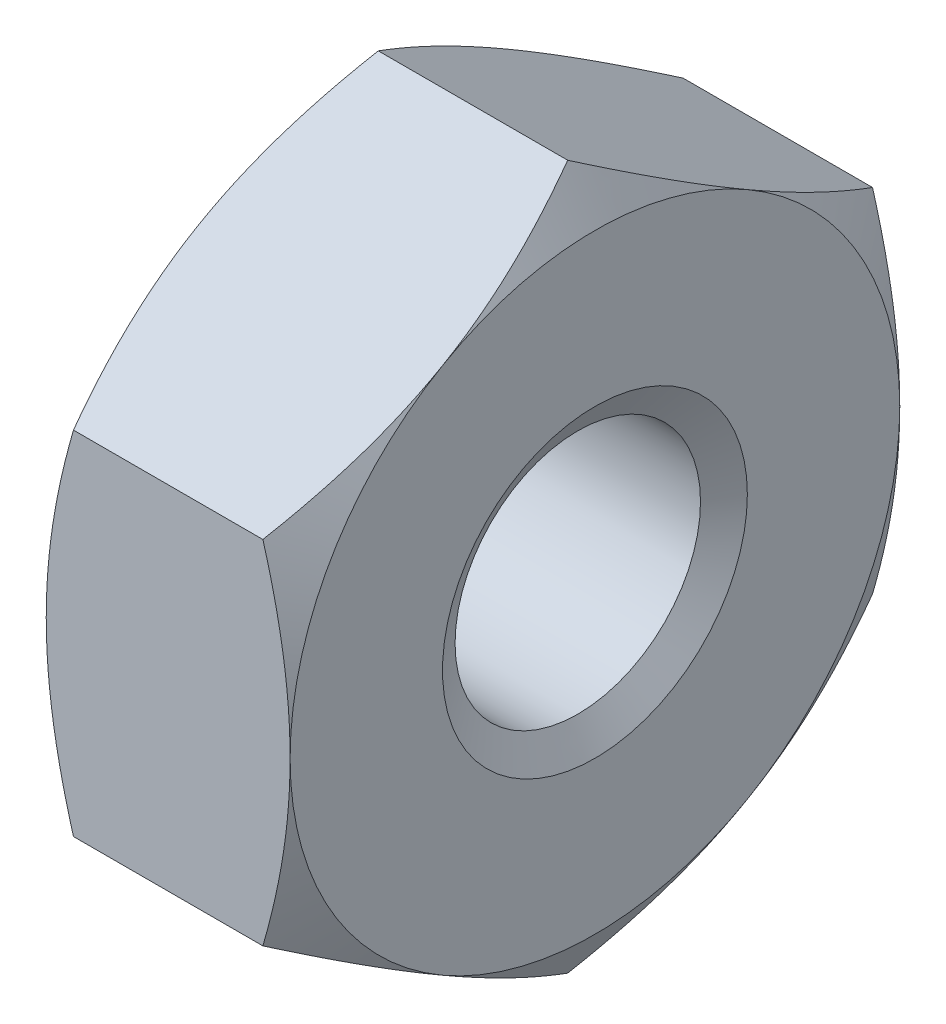
ISO-10303-21;
HEADER;
FILE_DESCRIPTION(('STEP AP214'),'2;1');
FILE_NAME('part.step','',(''),(''),'','','');
FILE_SCHEMA(('AUTOMOTIVE_DESIGN { 1 0 10303 214 1 1 1 1 }'));
ENDSEC;
DATA;
#1=APPLICATION_CONTEXT('core data for automotive mechanical design processes');
#2=APPLICATION_PROTOCOL_DEFINITION('international standard','automotive_design',2000,#1);
#3=PRODUCT_CONTEXT('',#1,'mechanical');
#4=PRODUCT('Part','Part','',(#3));
#5=PRODUCT_RELATED_PRODUCT_CATEGORY('part','',(#4));
#6=PRODUCT_DEFINITION_FORMATION('','',#4);
#7=PRODUCT_DEFINITION_CONTEXT('part definition',#1,'design');
#8=PRODUCT_DEFINITION('design','',#6,#7);
#9=PRODUCT_DEFINITION_SHAPE('','',#8);
#10=(LENGTH_UNIT() NAMED_UNIT(*) SI_UNIT(.MILLI.,.METRE.));
#11=(NAMED_UNIT(*) PLANE_ANGLE_UNIT() SI_UNIT($,.RADIAN.));
#12=(NAMED_UNIT(*) SI_UNIT($,.STERADIAN.) SOLID_ANGLE_UNIT());
#13=UNCERTAINTY_MEASURE_WITH_UNIT(LENGTH_MEASURE(1.E-05),#10,'distance_accuracy_value','');
#14=(GEOMETRIC_REPRESENTATION_CONTEXT(3) GLOBAL_UNCERTAINTY_ASSIGNED_CONTEXT((#13)) GLOBAL_UNIT_ASSIGNED_CONTEXT((#10,
#11,#12)) REPRESENTATION_CONTEXT('',''));
#15=CARTESIAN_POINT('',(0.,0.,0.));
#16=DIRECTION('',(0.,0.,1.));
#17=DIRECTION('',(1.,0.,0.));
#18=AXIS2_PLACEMENT_3D('',#15,#16,#17);
#19=CARTESIAN_POINT('',(0.,-1.44337567297406,-2.5));
#20=DIRECTION('',(0.,-0.866025403784438,-0.5));
#21=DIRECTION('',(0.,0.5,-0.866025403784438));
#22=AXIS2_PLACEMENT_3D('',#19,#20,#21);
#23=PLANE('',#22);
#24=CARTESIAN_POINT('',(0.,-2.16506350946109,-1.25));
#25=CARTESIAN_POINT('',(0.,-1.83012701892219,-1.83012701892219));
#26=CARTESIAN_POINT('',(0.223290993692602,-1.44337567297406,-2.5));
#27=(BOUNDED_CURVE() B_SPLINE_CURVE(2,(#24,#25,#26),.UNSPECIFIED.,.F.,
.F.) B_SPLINE_CURVE_WITH_KNOTS((3,3),(0.146427429693811,0.292854859387622),
.UNSPECIFIED.) CURVE() GEOMETRIC_REPRESENTATION_ITEM() RATIONAL_B_SPLINE_CURVE((1.,
1.03795484930203,1.)) REPRESENTATION_ITEM(''));
#28=CARTESIAN_POINT('',(0.,-2.16506350946109,-1.25));
#29=VERTEX_POINT('',#28);
#30=CARTESIAN_POINT('',(0.223290993692602,-1.44337567297406,-2.5));
#31=VERTEX_POINT('',#30);
#32=EDGE_CURVE('E382',#29,#31,#27,.T.);
#33=ORIENTED_EDGE('',*,*,#32,.T.);
#34=DIRECTION('',(1.,0.,0.));
#35=VECTOR('',#34,1.);
#36=CARTESIAN_POINT('',(0.,-1.44337567297406,-2.5));
#37=LINE('',#36,#35);
#38=CARTESIAN_POINT('',(1.7767090063074,-1.44337567297406,-2.5));
#39=VERTEX_POINT('',#38);
#40=EDGE_CURVE('E11',#31,#39,#37,.T.);
#41=ORIENTED_EDGE('',*,*,#40,.T.);
#42=CARTESIAN_POINT('',(1.7767090063074,-1.44337567297406,-2.5));
#43=CARTESIAN_POINT('',(2.,-1.83012701892219,-1.8301270189222));
#44=CARTESIAN_POINT('',(2.,-2.16506350946109,-1.25));
#45=(BOUNDED_CURVE() B_SPLINE_CURVE(2,(#42,#43,#44),.UNSPECIFIED.,.F.,
.F.) B_SPLINE_CURVE_WITH_KNOTS((3,3),(0.,0.146427429693811),
.UNSPECIFIED.) CURVE() GEOMETRIC_REPRESENTATION_ITEM() RATIONAL_B_SPLINE_CURVE((1.,
1.03795484930204,1.)) REPRESENTATION_ITEM(''));
#46=CARTESIAN_POINT('',(2.,-2.16506350946109,-1.25));
#47=VERTEX_POINT('',#46);
#48=EDGE_CURVE('E244',#39,#47,#45,.T.);
#49=ORIENTED_EDGE('',*,*,#48,.T.);
#50=CARTESIAN_POINT('',(2.,-2.16506350946109,-1.25));
#51=CARTESIAN_POINT('',(2.,-2.5,-0.669872981077806));
#52=CARTESIAN_POINT('',(1.7767090063074,-2.88675134594813,0.));
#53=(BOUNDED_CURVE() B_SPLINE_CURVE(2,(#50,#51,#52),.UNSPECIFIED.,.F.,
.F.) B_SPLINE_CURVE_WITH_KNOTS((3,3),(0.146427429693811,0.292854859387622),
.UNSPECIFIED.) CURVE() GEOMETRIC_REPRESENTATION_ITEM() RATIONAL_B_SPLINE_CURVE((1.,
1.03795484930203,1.)) REPRESENTATION_ITEM(''));
#54=CARTESIAN_POINT('',(1.7767090063074,-2.88675134594813,0.));
#55=VERTEX_POINT('',#54);
#56=EDGE_CURVE('E336',#47,#55,#53,.T.);
#57=ORIENTED_EDGE('',*,*,#56,.T.);
#58=DIRECTION('',(1.,0.,0.));
#59=VECTOR('',#58,1.);
#60=CARTESIAN_POINT('',(0.,-2.88675134594813,0.));
#61=LINE('',#60,#59);
#62=CARTESIAN_POINT('',(0.223290993692602,-2.88675134594813,0.));
#63=VERTEX_POINT('',#62);
#64=EDGE_CURVE('E159',#63,#55,#61,.T.);
#65=ORIENTED_EDGE('',*,*,#64,.F.);
#66=CARTESIAN_POINT('',(0.223290993692602,-2.88675134594813,0.));
#67=CARTESIAN_POINT('',(0.,-2.5,-0.669872981077807));
#68=CARTESIAN_POINT('',(0.,-2.16506350946109,-1.25));
#69=(BOUNDED_CURVE() B_SPLINE_CURVE(2,(#66,#67,#68),.UNSPECIFIED.,.F.,
.F.) B_SPLINE_CURVE_WITH_KNOTS((3,3),(0.,0.146427429693811),
.UNSPECIFIED.) CURVE() GEOMETRIC_REPRESENTATION_ITEM() RATIONAL_B_SPLINE_CURVE((1.,
1.03795484930203,1.)) REPRESENTATION_ITEM(''));
#70=EDGE_CURVE('E256',#63,#29,#69,.T.);
#71=ORIENTED_EDGE('',*,*,#70,.T.);
#72=EDGE_LOOP('',(#33,#41,#49,#57,#65,#71));
#73=FACE_BOUND('',#72,.T.);
#74=ADVANCED_FACE('F17',(#73),#23,.T.);
#75=CARTESIAN_POINT('',(0.,1.44337567297407,-2.5));
#76=DIRECTION('',(0.,0.,-1.));
#77=DIRECTION('',(-1.,0.,0.));
#78=AXIS2_PLACEMENT_3D('',#75,#76,#77);
#79=PLANE('',#78);
#80=CARTESIAN_POINT('',(0.,0.,-2.5));
#81=CARTESIAN_POINT('',(0.,0.669872981077811,-2.5));
#82=CARTESIAN_POINT('',(0.223290993692602,1.44337567297407,-2.5));
#83=(BOUNDED_CURVE() B_SPLINE_CURVE(2,(#80,#81,#82),.UNSPECIFIED.,.F.,
.F.) B_SPLINE_CURVE_WITH_KNOTS((3,3),(0.146427429693811,0.292854859387621),
.UNSPECIFIED.) CURVE() GEOMETRIC_REPRESENTATION_ITEM() RATIONAL_B_SPLINE_CURVE((1.,
1.03795484930204,1.)) REPRESENTATION_ITEM(''));
#84=CARTESIAN_POINT('',(0.,0.,-2.5));
#85=VERTEX_POINT('',#84);
#86=CARTESIAN_POINT('',(0.223290993692602,1.44337567297407,-2.5));
#87=VERTEX_POINT('',#86);
#88=EDGE_CURVE('E163',#85,#87,#83,.T.);
#89=ORIENTED_EDGE('',*,*,#88,.T.);
#90=DIRECTION('',(1.,0.,0.));
#91=VECTOR('',#90,1.);
#92=CARTESIAN_POINT('',(0.,1.44337567297407,-2.5));
#93=LINE('',#92,#91);
#94=CARTESIAN_POINT('',(1.7767090063074,1.44337567297407,-2.5));
#95=VERTEX_POINT('',#94);
#96=EDGE_CURVE('E28',#87,#95,#93,.T.);
#97=ORIENTED_EDGE('',*,*,#96,.T.);
#98=CARTESIAN_POINT('',(1.7767090063074,1.44337567297407,-2.5));
#99=CARTESIAN_POINT('',(2.,0.66987298107781,-2.5));
#100=CARTESIAN_POINT('',(2.,0.,-2.5));
#101=(BOUNDED_CURVE() B_SPLINE_CURVE(2,(#98,#99,#100),.UNSPECIFIED.,.F.,
.F.) B_SPLINE_CURVE_WITH_KNOTS((3,3),(0.,0.146427429693811),
.UNSPECIFIED.) CURVE() GEOMETRIC_REPRESENTATION_ITEM() RATIONAL_B_SPLINE_CURVE((1.,
1.03795484930205,1.)) REPRESENTATION_ITEM(''));
#102=CARTESIAN_POINT('',(2.,0.,-2.5));
#103=VERTEX_POINT('',#102);
#104=EDGE_CURVE('E312',#95,#103,#101,.T.);
#105=ORIENTED_EDGE('',*,*,#104,.T.);
#106=CARTESIAN_POINT('',(2.,0.,-2.5));
#107=CARTESIAN_POINT('',(2.,-0.669872981077801,-2.5));
#108=CARTESIAN_POINT('',(1.7767090063074,-1.44337567297406,-2.5));
#109=(BOUNDED_CURVE() B_SPLINE_CURVE(2,(#106,#107,#108),.UNSPECIFIED.,.F.,
.F.) B_SPLINE_CURVE_WITH_KNOTS((3,3),(0.146427429693811,0.292854859387622),
.UNSPECIFIED.) CURVE() GEOMETRIC_REPRESENTATION_ITEM() RATIONAL_B_SPLINE_CURVE((1.,
1.03795484930206,1.)) REPRESENTATION_ITEM(''));
#110=EDGE_CURVE('E327',#103,#39,#109,.T.);
#111=ORIENTED_EDGE('',*,*,#110,.T.);
#112=ORIENTED_EDGE('',*,*,#40,.F.);
#113=CARTESIAN_POINT('',(0.223290993692602,-1.44337567297406,-2.5));
#114=CARTESIAN_POINT('',(0.,-0.669872981077801,-2.5));
#115=CARTESIAN_POINT('',(0.,0.,-2.5));
#116=(BOUNDED_CURVE() B_SPLINE_CURVE(2,(#113,#114,#115),.UNSPECIFIED.,.F.,
.F.) B_SPLINE_CURVE_WITH_KNOTS((3,3),(0.,0.146427429693811),
.UNSPECIFIED.) CURVE() GEOMETRIC_REPRESENTATION_ITEM() RATIONAL_B_SPLINE_CURVE((1.,
1.03795484930204,1.)) REPRESENTATION_ITEM(''));
#117=EDGE_CURVE('E166',#31,#85,#116,.T.);
#118=ORIENTED_EDGE('',*,*,#117,.T.);
#119=EDGE_LOOP('',(#89,#97,#105,#111,#112,#118));
#120=FACE_BOUND('',#119,.T.);
#121=ADVANCED_FACE('F164',(#120),#79,.T.);
#122=CARTESIAN_POINT('',(0.,2.88675134594813,0.));
#123=DIRECTION('',(0.,0.866025403784439,-0.5));
#124=DIRECTION('',(-1.,0.,0.));
#125=AXIS2_PLACEMENT_3D('',#122,#123,#124);
#126=PLANE('',#125);
#127=CARTESIAN_POINT('',(0.,2.1650635094611,-1.25));
#128=CARTESIAN_POINT('',(0.,2.5,-0.669872981077807));
#129=CARTESIAN_POINT('',(0.223290993692602,2.88675134594813,0.));
#130=(BOUNDED_CURVE() B_SPLINE_CURVE(2,(#127,#128,#129),.UNSPECIFIED.,.F.,
.F.) B_SPLINE_CURVE_WITH_KNOTS((3,3),(0.146427429693811,0.292854859387621),
.UNSPECIFIED.) CURVE() GEOMETRIC_REPRESENTATION_ITEM() RATIONAL_B_SPLINE_CURVE((1.,
1.03795484930205,1.)) REPRESENTATION_ITEM(''));
#131=CARTESIAN_POINT('',(0.,2.1650635094611,-1.25));
#132=VERTEX_POINT('',#131);
#133=CARTESIAN_POINT('',(0.223290993692602,2.88675134594813,0.));
#134=VERTEX_POINT('',#133);
#135=EDGE_CURVE('E187',#132,#134,#130,.T.);
#136=ORIENTED_EDGE('',*,*,#135,.T.);
#137=DIRECTION('',(1.,0.,0.));
#138=VECTOR('',#137,1.);
#139=CARTESIAN_POINT('',(0.,2.88675134594813,0.));
#140=LINE('',#139,#138);
#141=CARTESIAN_POINT('',(1.7767090063074,2.88675134594813,0.));
#142=VERTEX_POINT('',#141);
#143=EDGE_CURVE('E42',#134,#142,#140,.T.);
#144=ORIENTED_EDGE('',*,*,#143,.T.);
#145=CARTESIAN_POINT('',(1.7767090063074,2.88675134594813,0.));
#146=CARTESIAN_POINT('',(2.,2.5,-0.669872981077809));
#147=CARTESIAN_POINT('',(2.,2.1650635094611,-1.25));
#148=(BOUNDED_CURVE() B_SPLINE_CURVE(2,(#145,#146,#147),.UNSPECIFIED.,.F.,
.F.) B_SPLINE_CURVE_WITH_KNOTS((3,3),(0.,0.146427429693811),
.UNSPECIFIED.) CURVE() GEOMETRIC_REPRESENTATION_ITEM() RATIONAL_B_SPLINE_CURVE((1.,
1.03795484930204,1.)) REPRESENTATION_ITEM(''));
#149=CARTESIAN_POINT('',(2.,2.1650635094611,-1.25));
#150=VERTEX_POINT('',#149);
#151=EDGE_CURVE('E250',#142,#150,#148,.T.);
#152=ORIENTED_EDGE('',*,*,#151,.T.);
#153=CARTESIAN_POINT('',(2.,2.1650635094611,-1.25));
#154=CARTESIAN_POINT('',(2.,1.8301270189222,-1.83012701892219));
#155=CARTESIAN_POINT('',(1.7767090063074,1.44337567297407,-2.5));
#156=(BOUNDED_CURVE() B_SPLINE_CURVE(2,(#153,#154,#155),.UNSPECIFIED.,.F.,
.F.) B_SPLINE_CURVE_WITH_KNOTS((3,3),(0.146427429693811,0.292854859387621),
.UNSPECIFIED.) CURVE() GEOMETRIC_REPRESENTATION_ITEM() RATIONAL_B_SPLINE_CURVE((1.,
1.03795484930203,1.)) REPRESENTATION_ITEM(''));
#157=EDGE_CURVE('E155',#150,#95,#156,.T.);
#158=ORIENTED_EDGE('',*,*,#157,.T.);
#159=ORIENTED_EDGE('',*,*,#96,.F.);
#160=CARTESIAN_POINT('',(0.223290993692602,1.44337567297407,-2.5));
#161=CARTESIAN_POINT('',(0.,1.8301270189222,-1.83012701892219));
#162=CARTESIAN_POINT('',(0.,2.1650635094611,-1.25));
#163=(BOUNDED_CURVE() B_SPLINE_CURVE(2,(#160,#161,#162),.UNSPECIFIED.,.F.,
.F.) B_SPLINE_CURVE_WITH_KNOTS((3,3),(0.,0.146427429693811),
.UNSPECIFIED.) CURVE() GEOMETRIC_REPRESENTATION_ITEM() RATIONAL_B_SPLINE_CURVE((1.,
1.03795484930203,1.)) REPRESENTATION_ITEM(''));
#164=EDGE_CURVE('E152',#87,#132,#163,.T.);
#165=ORIENTED_EDGE('',*,*,#164,.T.);
#166=EDGE_LOOP('',(#136,#144,#152,#158,#159,#165));
#167=FACE_BOUND('',#166,.T.);
#168=ADVANCED_FACE('F150',(#167),#126,.T.);
#169=CARTESIAN_POINT('',(0.,-2.88675134594813,0.));
#170=DIRECTION('',(0.,-0.866025403784439,0.5));
#171=DIRECTION('',(-1.,0.,0.));
#172=AXIS2_PLACEMENT_3D('',#169,#170,#171);
#173=PLANE('',#172);
#174=CARTESIAN_POINT('',(0.223290993692602,-1.44337567297407,2.5));
#175=CARTESIAN_POINT('',(0.,-1.8301270189222,1.83012701892219));
#176=CARTESIAN_POINT('',(0.,-2.1650635094611,1.25));
#177=(BOUNDED_CURVE() B_SPLINE_CURVE(2,(#174,#175,#176),.UNSPECIFIED.,.F.,
.F.) B_SPLINE_CURVE_WITH_KNOTS((3,3),(0.,0.146427429693811),
.UNSPECIFIED.) CURVE() GEOMETRIC_REPRESENTATION_ITEM() RATIONAL_B_SPLINE_CURVE((1.,
1.03795484930204,1.)) REPRESENTATION_ITEM(''));
#178=CARTESIAN_POINT('',(0.223290993692602,-1.44337567297406,2.5));
#179=VERTEX_POINT('',#178);
#180=CARTESIAN_POINT('',(0.,-2.1650635094611,1.25));
#181=VERTEX_POINT('',#180);
#182=EDGE_CURVE('E177',#179,#181,#177,.T.);
#183=ORIENTED_EDGE('',*,*,#182,.T.);
#184=CARTESIAN_POINT('',(0.,-2.1650635094611,1.25));
#185=CARTESIAN_POINT('',(0.,-2.5,0.669872981077809));
#186=CARTESIAN_POINT('',(0.223290993692602,-2.88675134594813,0.));
#187=(BOUNDED_CURVE() B_SPLINE_CURVE(2,(#184,#185,#186),.UNSPECIFIED.,.F.,
.F.) B_SPLINE_CURVE_WITH_KNOTS((3,3),(0.146427429693811,0.292854859387621),
.UNSPECIFIED.) CURVE() GEOMETRIC_REPRESENTATION_ITEM() RATIONAL_B_SPLINE_CURVE((1.,
1.03795484930204,1.)) REPRESENTATION_ITEM(''));
#188=EDGE_CURVE('E265',#181,#63,#187,.T.);
#189=ORIENTED_EDGE('',*,*,#188,.T.);
#190=ORIENTED_EDGE('',*,*,#64,.T.);
#191=CARTESIAN_POINT('',(1.7767090063074,-2.88675134594813,0.));
#192=CARTESIAN_POINT('',(2.,-2.5,0.669872981077809));
#193=CARTESIAN_POINT('',(2.,-2.1650635094611,1.25));
#194=(BOUNDED_CURVE() B_SPLINE_CURVE(2,(#191,#192,#193),.UNSPECIFIED.,.F.,
.F.) B_SPLINE_CURVE_WITH_KNOTS((3,3),(0.,0.146427429693811),
.UNSPECIFIED.) CURVE() GEOMETRIC_REPRESENTATION_ITEM() RATIONAL_B_SPLINE_CURVE((1.,
1.03795484930204,1.)) REPRESENTATION_ITEM(''));
#195=CARTESIAN_POINT('',(2.,-2.1650635094611,1.25));
#196=VERTEX_POINT('',#195);
#197=EDGE_CURVE('E355',#55,#196,#194,.T.);
#198=ORIENTED_EDGE('',*,*,#197,.T.);
#199=CARTESIAN_POINT('',(2.,-2.1650635094611,1.25));
#200=CARTESIAN_POINT('',(2.,-1.8301270189222,1.83012701892219));
#201=CARTESIAN_POINT('',(1.7767090063074,-1.44337567297407,2.5));
#202=(BOUNDED_CURVE() B_SPLINE_CURVE(2,(#199,#200,#201),.UNSPECIFIED.,.F.,
.F.) B_SPLINE_CURVE_WITH_KNOTS((3,3),(0.146427429693811,0.292854859387621),
.UNSPECIFIED.) CURVE() GEOMETRIC_REPRESENTATION_ITEM() RATIONAL_B_SPLINE_CURVE((1.,
1.03795484930204,1.)) REPRESENTATION_ITEM(''));
#203=CARTESIAN_POINT('',(1.7767090063074,-1.44337567297406,2.5));
#204=VERTEX_POINT('',#203);
#205=EDGE_CURVE('E197',#196,#204,#202,.T.);
#206=ORIENTED_EDGE('',*,*,#205,.T.);
#207=DIRECTION('',(1.,0.,0.));
#208=VECTOR('',#207,1.);
#209=CARTESIAN_POINT('',(0.,-1.44337567297407,2.5));
#210=LINE('',#209,#208);
#211=EDGE_CURVE('E142',#179,#204,#210,.T.);
#212=ORIENTED_EDGE('',*,*,#211,.F.);
#213=EDGE_LOOP('',(#183,#189,#190,#198,#206,#212));
#214=FACE_BOUND('',#213,.T.);
#215=ADVANCED_FACE('F831',(#214),#173,.T.);
#216=CARTESIAN_POINT('',(0.,-1.44337567297407,2.5));
#217=DIRECTION('',(0.,0.,1.));
#218=DIRECTION('',(1.,0.,0.));
#219=AXIS2_PLACEMENT_3D('',#216,#217,#218);
#220=PLANE('',#219);
#221=CARTESIAN_POINT('',(0.223290993692602,1.44337567297406,2.5));
#222=CARTESIAN_POINT('',(0.,0.669872981077806,2.5));
#223=CARTESIAN_POINT('',(0.,0.,2.5));
#224=(BOUNDED_CURVE() B_SPLINE_CURVE(2,(#221,#222,#223),.UNSPECIFIED.,.F.,
.F.) B_SPLINE_CURVE_WITH_KNOTS((3,3),(0.,0.14642742969381),
.UNSPECIFIED.) CURVE() GEOMETRIC_REPRESENTATION_ITEM() RATIONAL_B_SPLINE_CURVE((1.,
1.03795484930203,1.)) REPRESENTATION_ITEM(''));
#225=CARTESIAN_POINT('',(0.223290993692602,1.44337567297406,2.5));
#226=VERTEX_POINT('',#225);
#227=CARTESIAN_POINT('',(0.,0.,2.5));
#228=VERTEX_POINT('',#227);
#229=EDGE_CURVE('E196',#226,#228,#224,.T.);
#230=ORIENTED_EDGE('',*,*,#229,.T.);
#231=CARTESIAN_POINT('',(0.,0.,2.5));
#232=CARTESIAN_POINT('',(0.,-0.669872981077806,2.5));
#233=CARTESIAN_POINT('',(0.223290993692602,-1.44337567297406,2.5));
#234=(BOUNDED_CURVE() B_SPLINE_CURVE(2,(#231,#232,#233),.UNSPECIFIED.,.F.,
.F.) B_SPLINE_CURVE_WITH_KNOTS((3,3),(0.14642742969381,0.292854859387621),
.UNSPECIFIED.) CURVE() GEOMETRIC_REPRESENTATION_ITEM() RATIONAL_B_SPLINE_CURVE((1.,
1.03795484930203,1.)) REPRESENTATION_ITEM(''));
#235=EDGE_CURVE('E182',#228,#179,#234,.T.);
#236=ORIENTED_EDGE('',*,*,#235,.T.);
#237=ORIENTED_EDGE('',*,*,#211,.T.);
#238=CARTESIAN_POINT('',(1.7767090063074,-1.44337567297406,2.5));
#239=CARTESIAN_POINT('',(2.,-0.669872981077803,2.5));
#240=CARTESIAN_POINT('',(2.,0.,2.5));
#241=(BOUNDED_CURVE() B_SPLINE_CURVE(2,(#238,#239,#240),.UNSPECIFIED.,.F.,
.F.) B_SPLINE_CURVE_WITH_KNOTS((3,3),(0.,0.14642742969381),
.UNSPECIFIED.) CURVE() GEOMETRIC_REPRESENTATION_ITEM() RATIONAL_B_SPLINE_CURVE((1.,
1.03795484930204,1.)) REPRESENTATION_ITEM(''));
#242=CARTESIAN_POINT('',(2.,0.,2.5));
#243=VERTEX_POINT('',#242);
#244=EDGE_CURVE('E205',#204,#243,#241,.T.);
#245=ORIENTED_EDGE('',*,*,#244,.T.);
#246=CARTESIAN_POINT('',(2.,0.,2.5));
#247=CARTESIAN_POINT('',(2.,0.669872981077803,2.5));
#248=CARTESIAN_POINT('',(1.7767090063074,1.44337567297406,2.5));
#249=(BOUNDED_CURVE() B_SPLINE_CURVE(2,(#246,#247,#248),.UNSPECIFIED.,.F.,
.F.) B_SPLINE_CURVE_WITH_KNOTS((3,3),(0.14642742969381,0.292854859387621),
.UNSPECIFIED.) CURVE() GEOMETRIC_REPRESENTATION_ITEM() RATIONAL_B_SPLINE_CURVE((1.,
1.03795484930204,1.)) REPRESENTATION_ITEM(''));
#250=CARTESIAN_POINT('',(1.7767090063074,1.44337567297406,2.5));
#251=VERTEX_POINT('',#250);
#252=EDGE_CURVE('E287',#243,#251,#249,.T.);
#253=ORIENTED_EDGE('',*,*,#252,.T.);
#254=DIRECTION('',(1.,0.,0.));
#255=VECTOR('',#254,1.);
#256=CARTESIAN_POINT('',(0.,1.44337567297406,2.5));
#257=LINE('',#256,#255);
#258=EDGE_CURVE('E21',#226,#251,#257,.T.);
#259=ORIENTED_EDGE('',*,*,#258,.F.);
#260=EDGE_LOOP('',(#230,#236,#237,#245,#253,#259));
#261=FACE_BOUND('',#260,.T.);
#262=ADVANCED_FACE('F513',(#261),#220,.T.);
#263=CARTESIAN_POINT('',(0.,1.44337567297406,2.5));
#264=DIRECTION('',(0.,0.866025403784439,0.5));
#265=DIRECTION('',(1.,0.,0.));
#266=AXIS2_PLACEMENT_3D('',#263,#264,#265);
#267=PLANE('',#266);
#268=CARTESIAN_POINT('',(0.223290993692602,2.88675134594813,0.));
#269=CARTESIAN_POINT('',(0.,2.5,0.669872981077808));
#270=CARTESIAN_POINT('',(0.,2.1650635094611,1.25));
#271=(BOUNDED_CURVE() B_SPLINE_CURVE(2,(#268,#269,#270),.UNSPECIFIED.,.F.,
.F.) B_SPLINE_CURVE_WITH_KNOTS((3,3),(0.,0.146427429693811),
.UNSPECIFIED.) CURVE() GEOMETRIC_REPRESENTATION_ITEM() RATIONAL_B_SPLINE_CURVE((1.,
1.03795484930204,1.)) REPRESENTATION_ITEM(''));
#272=CARTESIAN_POINT('',(0.,2.1650635094611,1.25));
#273=VERTEX_POINT('',#272);
#274=EDGE_CURVE('E195',#134,#273,#271,.T.);
#275=ORIENTED_EDGE('',*,*,#274,.T.);
#276=CARTESIAN_POINT('',(0.,2.1650635094611,1.25));
#277=CARTESIAN_POINT('',(0.,1.83012701892219,1.8301270189222));
#278=CARTESIAN_POINT('',(0.223290993692602,1.44337567297406,2.5));
#279=(BOUNDED_CURVE() B_SPLINE_CURVE(2,(#276,#277,#278),.UNSPECIFIED.,.F.,
.F.) B_SPLINE_CURVE_WITH_KNOTS((3,3),(0.146427429693811,0.292854859387621),
.UNSPECIFIED.) CURVE() GEOMETRIC_REPRESENTATION_ITEM() RATIONAL_B_SPLINE_CURVE((1.,
1.03795484930205,1.)) REPRESENTATION_ITEM(''));
#280=EDGE_CURVE('E170',#273,#226,#279,.T.);
#281=ORIENTED_EDGE('',*,*,#280,.T.);
#282=ORIENTED_EDGE('',*,*,#258,.T.);
#283=CARTESIAN_POINT('',(1.7767090063074,1.44337567297406,2.5));
#284=CARTESIAN_POINT('',(2.,1.83012701892219,1.8301270189222));
#285=CARTESIAN_POINT('',(2.,2.1650635094611,1.25));
#286=(BOUNDED_CURVE() B_SPLINE_CURVE(2,(#283,#284,#285),.UNSPECIFIED.,.F.,
.F.) B_SPLINE_CURVE_WITH_KNOTS((3,3),(0.,0.146427429693811),
.UNSPECIFIED.) CURVE() GEOMETRIC_REPRESENTATION_ITEM() RATIONAL_B_SPLINE_CURVE((1.,
1.03795484930206,1.)) REPRESENTATION_ITEM(''));
#287=CARTESIAN_POINT('',(2.,2.1650635094611,1.25));
#288=VERTEX_POINT('',#287);
#289=EDGE_CURVE('E204',#251,#288,#286,.T.);
#290=ORIENTED_EDGE('',*,*,#289,.T.);
#291=CARTESIAN_POINT('',(2.,2.1650635094611,1.25));
#292=CARTESIAN_POINT('',(2.,2.5,0.669872981077808));
#293=CARTESIAN_POINT('',(1.7767090063074,2.88675134594813,0.));
#294=(BOUNDED_CURVE() B_SPLINE_CURVE(2,(#291,#292,#293),.UNSPECIFIED.,.F.,
.F.) B_SPLINE_CURVE_WITH_KNOTS((3,3),(0.146427429693811,0.292854859387621),
.UNSPECIFIED.) CURVE() GEOMETRIC_REPRESENTATION_ITEM() RATIONAL_B_SPLINE_CURVE((1.,
1.03795484930205,1.)) REPRESENTATION_ITEM(''));
#295=EDGE_CURVE('E255',#288,#142,#294,.T.);
#296=ORIENTED_EDGE('',*,*,#295,.T.);
#297=ORIENTED_EDGE('',*,*,#143,.F.);
#298=EDGE_LOOP('',(#275,#281,#282,#290,#296,#297));
#299=FACE_BOUND('',#298,.T.);
#300=ADVANCED_FACE('F469',(#299),#267,.T.);
#301=CARTESIAN_POINT('',(1.8883545031537,0.,0.));
#302=DIRECTION('',(-1.,0.,0.));
#303=DIRECTION('',(0.,1.,0.));
#304=AXIS2_PLACEMENT_3D('',#301,#302,#303);
#305=CONICAL_SURFACE('',#304,2.69337567297406,1.0471975511966);
#306=ORIENTED_EDGE('',*,*,#295,.F.);
#307=CARTESIAN_POINT('',(2.,0.,0.));
#308=DIRECTION('',(1.,0.,0.));
#309=DIRECTION('',(0.,1.,0.));
#310=AXIS2_PLACEMENT_3D('',#307,#308,#309);
#311=CIRCLE('',#310,2.5);
#312=EDGE_CURVE('E220',#150,#288,#311,.T.);
#313=ORIENTED_EDGE('',*,*,#312,.F.);
#314=ORIENTED_EDGE('',*,*,#151,.F.);
#315=EDGE_LOOP('',(#306,#313,#314));
#316=FACE_BOUND('',#315,.T.);
#317=ADVANCED_FACE('F464',(#316),#305,.T.);
#318=CARTESIAN_POINT('',(1.8883545031537,0.,0.));
#319=DIRECTION('',(-1.,0.,0.));
#320=DIRECTION('',(0.,1.,0.));
#321=AXIS2_PLACEMENT_3D('',#318,#319,#320);
#322=CONICAL_SURFACE('',#321,2.69337567297406,1.0471975511966);
#323=ORIENTED_EDGE('',*,*,#157,.F.);
#324=CARTESIAN_POINT('',(2.,0.,0.));
#325=DIRECTION('',(1.,0.,0.));
#326=DIRECTION('',(0.,1.,0.));
#327=AXIS2_PLACEMENT_3D('',#324,#325,#326);
#328=CIRCLE('',#327,2.5);
#329=EDGE_CURVE('E224',#103,#150,#328,.T.);
#330=ORIENTED_EDGE('',*,*,#329,.F.);
#331=ORIENTED_EDGE('',*,*,#104,.F.);
#332=EDGE_LOOP('',(#323,#330,#331));
#333=FACE_BOUND('',#332,.T.);
#334=ADVANCED_FACE('F462',(#333),#322,.T.);
#335=CARTESIAN_POINT('',(1.8883545031537,0.,0.));
#336=DIRECTION('',(-1.,0.,0.));
#337=DIRECTION('',(0.,1.,0.));
#338=AXIS2_PLACEMENT_3D('',#335,#336,#337);
#339=CONICAL_SURFACE('',#338,2.69337567297406,1.0471975511966);
#340=ORIENTED_EDGE('',*,*,#289,.F.);
#341=ORIENTED_EDGE('',*,*,#252,.F.);
#342=CARTESIAN_POINT('',(2.,0.,0.));
#343=DIRECTION('',(1.,0.,0.));
#344=DIRECTION('',(0.,1.,0.));
#345=AXIS2_PLACEMENT_3D('',#342,#343,#344);
#346=CIRCLE('',#345,2.5);
#347=EDGE_CURVE('E212',#288,#243,#346,.T.);
#348=ORIENTED_EDGE('',*,*,#347,.F.);
#349=EDGE_LOOP('',(#340,#341,#348));
#350=FACE_BOUND('',#349,.T.);
#351=ADVANCED_FACE('F472',(#350),#339,.T.);
#352=CARTESIAN_POINT('',(1.8883545031537,0.,0.));
#353=DIRECTION('',(-1.,0.,0.));
#354=DIRECTION('',(0.,1.,0.));
#355=AXIS2_PLACEMENT_3D('',#352,#353,#354);
#356=CONICAL_SURFACE('',#355,2.69337567297406,1.0471975511966);
#357=ORIENTED_EDGE('',*,*,#244,.F.);
#358=ORIENTED_EDGE('',*,*,#205,.F.);
#359=CARTESIAN_POINT('',(2.,0.,0.));
#360=DIRECTION('',(1.,0.,0.));
#361=DIRECTION('',(0.,1.,0.));
#362=AXIS2_PLACEMENT_3D('',#359,#360,#361);
#363=CIRCLE('',#362,2.5);
#364=EDGE_CURVE('E219',#243,#196,#363,.T.);
#365=ORIENTED_EDGE('',*,*,#364,.F.);
#366=EDGE_LOOP('',(#357,#358,#365));
#367=FACE_BOUND('',#366,.T.);
#368=ADVANCED_FACE('F782',(#367),#356,.T.);
#369=CARTESIAN_POINT('',(1.8883545031537,0.,0.));
#370=DIRECTION('',(-1.,0.,0.));
#371=DIRECTION('',(0.,1.,0.));
#372=AXIS2_PLACEMENT_3D('',#369,#370,#371);
#373=CONICAL_SURFACE('',#372,2.69337567297406,1.0471975511966);
#374=ORIENTED_EDGE('',*,*,#110,.F.);
#375=CARTESIAN_POINT('',(2.,0.,0.));
#376=DIRECTION('',(1.,0.,0.));
#377=DIRECTION('',(0.,1.,0.));
#378=AXIS2_PLACEMENT_3D('',#375,#376,#377);
#379=CIRCLE('',#378,2.5);
#380=EDGE_CURVE('E266',#47,#103,#379,.T.);
#381=ORIENTED_EDGE('',*,*,#380,.F.);
#382=ORIENTED_EDGE('',*,*,#48,.F.);
#383=EDGE_LOOP('',(#374,#381,#382));
#384=FACE_BOUND('',#383,.T.);
#385=ADVANCED_FACE('F773',(#384),#373,.T.);
#386=CARTESIAN_POINT('',(1.8883545031537,0.,0.));
#387=DIRECTION('',(-1.,0.,0.));
#388=DIRECTION('',(0.,-1.,0.));
#389=AXIS2_PLACEMENT_3D('',#386,#387,#388);
#390=CONICAL_SURFACE('',#389,2.69337567297406,1.0471975511966);
#391=ORIENTED_EDGE('',*,*,#197,.F.);
#392=ORIENTED_EDGE('',*,*,#56,.F.);
#393=CARTESIAN_POINT('',(2.,0.,0.));
#394=DIRECTION('',(1.,0.,0.));
#395=DIRECTION('',(0.,1.,0.));
#396=AXIS2_PLACEMENT_3D('',#393,#394,#395);
#397=CIRCLE('',#396,2.5);
#398=EDGE_CURVE('E296',#196,#47,#397,.T.);
#399=ORIENTED_EDGE('',*,*,#398,.F.);
#400=EDGE_LOOP('',(#391,#392,#399));
#401=FACE_BOUND('',#400,.T.);
#402=ADVANCED_FACE('F764',(#401),#390,.T.);
#403=CARTESIAN_POINT('',(0.111645496846301,0.,0.));
#404=DIRECTION('',(1.,0.,0.));
#405=DIRECTION('',(0.,1.,0.));
#406=AXIS2_PLACEMENT_3D('',#403,#404,#405);
#407=CONICAL_SURFACE('',#406,2.69337567297406,1.0471975511966);
#408=ORIENTED_EDGE('',*,*,#135,.F.);
#409=CARTESIAN_POINT('',(0.,0.,0.));
#410=DIRECTION('',(-1.,0.,0.));
#411=DIRECTION('',(0.,1.,0.));
#412=AXIS2_PLACEMENT_3D('',#409,#410,#411);
#413=CIRCLE('',#412,2.5);
#414=EDGE_CURVE('E228',#273,#132,#413,.T.);
#415=ORIENTED_EDGE('',*,*,#414,.F.);
#416=ORIENTED_EDGE('',*,*,#274,.F.);
#417=EDGE_LOOP('',(#408,#415,#416));
#418=FACE_BOUND('',#417,.T.);
#419=ADVANCED_FACE('F505',(#418),#407,.T.);
#420=CARTESIAN_POINT('',(0.111645496846301,0.,0.));
#421=DIRECTION('',(1.,0.,0.));
#422=DIRECTION('',(0.,1.,0.));
#423=AXIS2_PLACEMENT_3D('',#420,#421,#422);
#424=CONICAL_SURFACE('',#423,2.69337567297406,1.0471975511966);
#425=ORIENTED_EDGE('',*,*,#280,.F.);
#426=CARTESIAN_POINT('',(0.,0.,0.));
#427=DIRECTION('',(-1.,0.,0.));
#428=DIRECTION('',(0.,1.,0.));
#429=AXIS2_PLACEMENT_3D('',#426,#427,#428);
#430=CIRCLE('',#429,2.5);
#431=EDGE_CURVE('E237',#228,#273,#430,.T.);
#432=ORIENTED_EDGE('',*,*,#431,.F.);
#433=ORIENTED_EDGE('',*,*,#229,.F.);
#434=EDGE_LOOP('',(#425,#432,#433));
#435=FACE_BOUND('',#434,.T.);
#436=ADVANCED_FACE('F504',(#435),#424,.T.);
#437=CARTESIAN_POINT('',(0.111645496846301,0.,0.));
#438=DIRECTION('',(1.,0.,0.));
#439=DIRECTION('',(0.,1.,0.));
#440=AXIS2_PLACEMENT_3D('',#437,#438,#439);
#441=CONICAL_SURFACE('',#440,2.69337567297406,1.0471975511966);
#442=ORIENTED_EDGE('',*,*,#164,.F.);
#443=ORIENTED_EDGE('',*,*,#88,.F.);
#444=CARTESIAN_POINT('',(0.,0.,0.));
#445=DIRECTION('',(-1.,0.,0.));
#446=DIRECTION('',(0.,1.,0.));
#447=AXIS2_PLACEMENT_3D('',#444,#445,#446);
#448=CIRCLE('',#447,2.5);
#449=EDGE_CURVE('E174',#132,#85,#448,.T.);
#450=ORIENTED_EDGE('',*,*,#449,.F.);
#451=EDGE_LOOP('',(#442,#443,#450));
#452=FACE_BOUND('',#451,.T.);
#453=ADVANCED_FACE('F172',(#452),#441,.T.);
#454=CARTESIAN_POINT('',(0.111645496846301,0.,0.));
#455=DIRECTION('',(1.,0.,0.));
#456=DIRECTION('',(0.,1.,0.));
#457=AXIS2_PLACEMENT_3D('',#454,#455,#456);
#458=CONICAL_SURFACE('',#457,2.69337567297406,1.0471975511966);
#459=ORIENTED_EDGE('',*,*,#235,.F.);
#460=CARTESIAN_POINT('',(0.,0.,0.));
#461=DIRECTION('',(-1.,0.,0.));
#462=DIRECTION('',(0.,1.,0.));
#463=AXIS2_PLACEMENT_3D('',#460,#461,#462);
#464=CIRCLE('',#463,2.5);
#465=EDGE_CURVE('E233',#181,#228,#464,.T.);
#466=ORIENTED_EDGE('',*,*,#465,.F.);
#467=ORIENTED_EDGE('',*,*,#182,.F.);
#468=EDGE_LOOP('',(#459,#466,#467));
#469=FACE_BOUND('',#468,.T.);
#470=ADVANCED_FACE('F512',(#469),#458,.T.);
#471=CARTESIAN_POINT('',(0.111645496846301,0.,0.));
#472=DIRECTION('',(1.,0.,0.));
#473=DIRECTION('',(0.,1.,0.));
#474=AXIS2_PLACEMENT_3D('',#471,#472,#473);
#475=CONICAL_SURFACE('',#474,2.69337567297406,1.0471975511966);
#476=ORIENTED_EDGE('',*,*,#117,.F.);
#477=ORIENTED_EDGE('',*,*,#32,.F.);
#478=CARTESIAN_POINT('',(0.,0.,0.));
#479=DIRECTION('',(-1.,0.,0.));
#480=DIRECTION('',(0.,1.,0.));
#481=AXIS2_PLACEMENT_3D('',#478,#479,#480);
#482=CIRCLE('',#481,2.5);
#483=EDGE_CURVE('E227',#85,#29,#482,.T.);
#484=ORIENTED_EDGE('',*,*,#483,.F.);
#485=EDGE_LOOP('',(#476,#477,#484));
#486=FACE_BOUND('',#485,.T.);
#487=ADVANCED_FACE('F19',(#486),#475,.T.);
#488=CARTESIAN_POINT('',(0.111645496846301,0.,0.));
#489=DIRECTION('',(1.,0.,0.));
#490=DIRECTION('',(0.,-1.,0.));
#491=AXIS2_PLACEMENT_3D('',#488,#489,#490);
#492=CONICAL_SURFACE('',#491,2.69337567297406,1.0471975511966);
#493=ORIENTED_EDGE('',*,*,#188,.F.);
#494=CARTESIAN_POINT('',(0.,0.,0.));
#495=DIRECTION('',(-1.,0.,0.));
#496=DIRECTION('',(0.,1.,0.));
#497=AXIS2_PLACEMENT_3D('',#494,#495,#496);
#498=CIRCLE('',#497,2.5);
#499=EDGE_CURVE('E238',#29,#181,#498,.T.);
#500=ORIENTED_EDGE('',*,*,#499,.F.);
#501=ORIENTED_EDGE('',*,*,#70,.F.);
#502=EDGE_LOOP('',(#493,#500,#501));
#503=FACE_BOUND('',#502,.T.);
#504=ADVANCED_FACE('F712',(#503),#492,.T.);
#505=CARTESIAN_POINT('',(2.,0.,0.));
#506=DIRECTION('',(1.,0.,0.));
#507=DIRECTION('',(0.,1.,0.));
#508=AXIS2_PLACEMENT_3D('',#505,#506,#507);
#509=PLANE('',#508);
#510=CARTESIAN_POINT('',(2.,0.,0.));
#511=DIRECTION('',(1.,0.,0.));
#512=DIRECTION('',(0.,0.,1.));
#513=AXIS2_PLACEMENT_3D('',#510,#511,#512);
#514=CIRCLE('',#513,1.25006964481437);
#515=CARTESIAN_POINT('',(2.,0.,-1.25006964481437));
#516=VERTEX_POINT('',#515);
#517=EDGE_CURVE('E273',#516,#516,#514,.T.);
#518=ORIENTED_EDGE('',*,*,#517,.F.);
#519=EDGE_LOOP('',(#518));
#520=FACE_BOUND('',#519,.T.);
#521=ORIENTED_EDGE('',*,*,#380,.T.);
#522=ORIENTED_EDGE('',*,*,#329,.T.);
#523=ORIENTED_EDGE('',*,*,#312,.T.);
#524=ORIENTED_EDGE('',*,*,#347,.T.);
#525=ORIENTED_EDGE('',*,*,#364,.T.);
#526=ORIENTED_EDGE('',*,*,#398,.T.);
#527=EDGE_LOOP('',(#521,#522,#523,#524,#525,#526));
#528=FACE_BOUND('',#527,.T.);
#529=ADVANCED_FACE('F458',(#520,#528),#509,.T.);
#530=CARTESIAN_POINT('',(1.9296875,0.,0.));
#531=DIRECTION('',(1.,0.,0.));
#532=DIRECTION('',(0.,0.,1.));
#533=AXIS2_PLACEMENT_3D('',#530,#531,#532);
#534=CONICAL_SURFACE('',#533,1.12828482240719,1.0471975511966);
#535=CARTESIAN_POINT('',(1.859375,0.,0.));
#536=DIRECTION('',(-1.,0.,0.));
#537=DIRECTION('',(0.,0.,1.));
#538=AXIS2_PLACEMENT_3D('',#535,#536,#537);
#539=CIRCLE('',#538,1.0065);
#540=CARTESIAN_POINT('',(1.859375,0.,-1.0065));
#541=VERTEX_POINT('',#540);
#542=CARTESIAN_POINT('',(1.859375,0.,1.0065));
#543=VERTEX_POINT('',#542);
#544=EDGE_CURVE('E277',#541,#543,#539,.T.);
#545=ORIENTED_EDGE('',*,*,#544,.T.);
#546=CARTESIAN_POINT('',(1.859375,0.,0.));
#547=DIRECTION('',(-1.,0.,0.));
#548=DIRECTION('',(0.,0.,1.));
#549=AXIS2_PLACEMENT_3D('',#546,#547,#548);
#550=CIRCLE('',#549,1.0065);
#551=EDGE_CURVE('E281',#543,#541,#550,.T.);
#552=ORIENTED_EDGE('',*,*,#551,.T.);
#553=DIRECTION('',(0.5,0.,-0.86602540378444));
#554=VECTOR('',#553,1.);
#555=CARTESIAN_POINT('',(1.9296875,0.,-1.12828482240719));
#556=LINE('',#555,#554);
#557=EDGE_CURVE('E306',#541,#516,#556,.T.);
#558=ORIENTED_EDGE('',*,*,#557,.T.);
#559=ORIENTED_EDGE('',*,*,#517,.T.);
#560=ORIENTED_EDGE('',*,*,#557,.F.);
#561=EDGE_LOOP('',(#545,#552,#558,#559,#560));
#562=FACE_BOUND('',#561,.T.);
#563=ADVANCED_FACE('F691',(#562),#534,.F.);
#564=CARTESIAN_POINT('',(0.,0.,0.));
#565=DIRECTION('',(1.,0.,0.));
#566=DIRECTION('',(0.,1.,0.));
#567=AXIS2_PLACEMENT_3D('',#564,#565,#566);
#568=PLANE('',#567);
#569=CARTESIAN_POINT('',(0.,0.,0.));
#570=DIRECTION('',(-1.,0.,0.));
#571=DIRECTION('',(0.,0.,-1.));
#572=AXIS2_PLACEMENT_3D('',#569,#570,#571);
#573=CIRCLE('',#572,1.25006964481437);
#574=CARTESIAN_POINT('',(0.,0.,1.25006964481437));
#575=VERTEX_POINT('',#574);
#576=EDGE_CURVE('E124',#575,#575,#573,.T.);
#577=ORIENTED_EDGE('',*,*,#576,.F.);
#578=EDGE_LOOP('',(#577));
#579=FACE_BOUND('',#578,.T.);
#580=ORIENTED_EDGE('',*,*,#499,.T.);
#581=ORIENTED_EDGE('',*,*,#465,.T.);
#582=ORIENTED_EDGE('',*,*,#431,.T.);
#583=ORIENTED_EDGE('',*,*,#414,.T.);
#584=ORIENTED_EDGE('',*,*,#449,.T.);
#585=ORIENTED_EDGE('',*,*,#483,.T.);
#586=EDGE_LOOP('',(#580,#581,#582,#583,#584,#585));
#587=FACE_BOUND('',#586,.T.);
#588=ADVANCED_FACE('F507',(#579,#587),#568,.F.);
#589=CARTESIAN_POINT('',(-5.89514618821801,0.,0.));
#590=DIRECTION('',(1.,0.,0.));
#591=DIRECTION('',(0.,0.,-1.));
#592=AXIS2_PLACEMENT_3D('',#589,#590,#591);
#593=CYLINDRICAL_SURFACE('',#592,1.0065);
#594=CARTESIAN_POINT('',(0.140625,0.,0.));
#595=DIRECTION('',(1.,0.,0.));
#596=DIRECTION('',(0.,0.,-1.));
#597=AXIS2_PLACEMENT_3D('',#594,#595,#596);
#598=CIRCLE('',#597,1.0065);
#599=CARTESIAN_POINT('',(0.140625,0.,1.0065));
#600=VERTEX_POINT('',#599);
#601=EDGE_CURVE('E232',#600,#600,#598,.T.);
#602=ORIENTED_EDGE('',*,*,#601,.F.);
#603=DIRECTION('',(1.,0.,0.));
#604=VECTOR('',#603,1.);
#605=CARTESIAN_POINT('',(-5.89514618821801,0.,1.0065));
#606=LINE('',#605,#604);
#607=EDGE_CURVE('E113',#600,#543,#606,.T.);
#608=ORIENTED_EDGE('',*,*,#607,.T.);
#609=ORIENTED_EDGE('',*,*,#544,.F.);
#610=ORIENTED_EDGE('',*,*,#551,.F.);
#611=ORIENTED_EDGE('',*,*,#607,.F.);
#612=EDGE_LOOP('',(#602,#608,#609,#610,#611));
#613=FACE_BOUND('',#612,.T.);
#614=ADVANCED_FACE('F670',(#613),#593,.F.);
#615=CARTESIAN_POINT('',(0.0703125,0.,0.));
#616=DIRECTION('',(-1.,0.,0.));
#617=DIRECTION('',(0.,0.,-1.));
#618=AXIS2_PLACEMENT_3D('',#615,#616,#617);
#619=CONICAL_SURFACE('',#618,1.12828482240719,1.0471975511966);
#620=ORIENTED_EDGE('',*,*,#601,.T.);
#621=DIRECTION('',(-0.5,0.,0.86602540378444));
#622=VECTOR('',#621,1.);
#623=CARTESIAN_POINT('',(0.0703125,0.,1.12828482240719));
#624=LINE('',#623,#622);
#625=EDGE_CURVE('E229',#600,#575,#624,.T.);
#626=ORIENTED_EDGE('',*,*,#625,.T.);
#627=ORIENTED_EDGE('',*,*,#576,.T.);
#628=ORIENTED_EDGE('',*,*,#625,.F.);
#629=EDGE_LOOP('',(#620,#626,#627,#628));
#630=FACE_BOUND('',#629,.T.);
#631=ADVANCED_FACE('F664',(#630),#619,.F.);
#632=CLOSED_SHELL('',(#74,#121,#168,#215,#262,#300,#317,#334,#351,#368,#385,#402,#419,#436,#453,
#470,#487,#504,#529,#563,#588,#614,#631));
#633=MANIFOLD_SOLID_BREP('B1',#632);
#634=ADVANCED_BREP_SHAPE_REPRESENTATION('',(#18,#633),#14);
#635=SHAPE_DEFINITION_REPRESENTATION(#9,#634);
ENDSEC;
END-ISO-10303-21;
